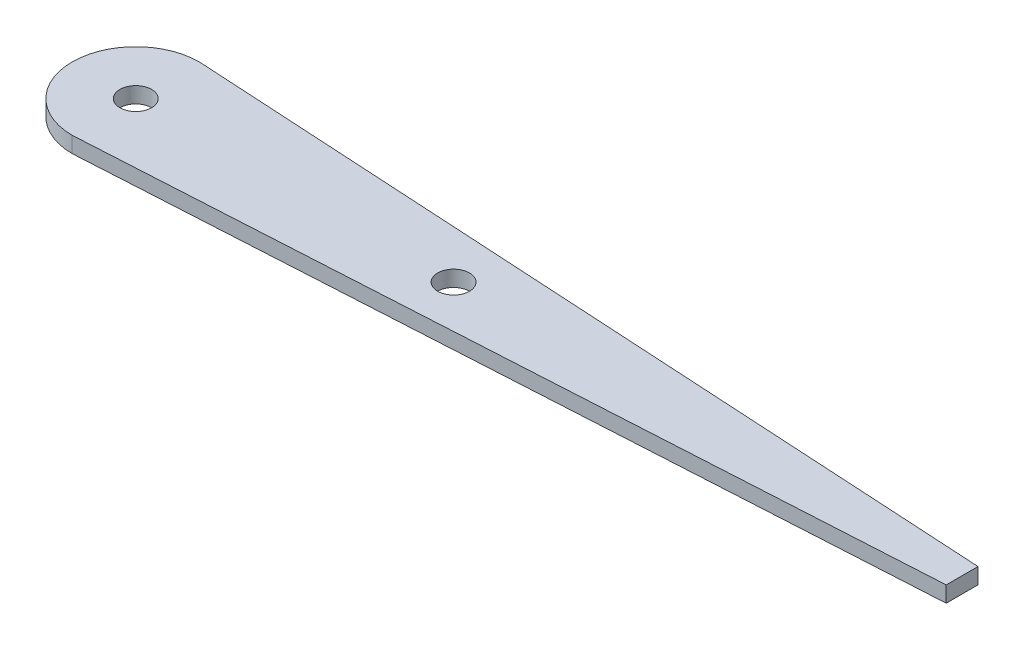
ISO-10303-21;
HEADER;
FILE_DESCRIPTION(('STEP AP214'),'2;1');
FILE_NAME('part.step','',(''),(''),'','','');
FILE_SCHEMA(('AUTOMOTIVE_DESIGN { 1 0 10303 214 1 1 1 1 }'));
ENDSEC;
DATA;
#1=APPLICATION_CONTEXT('core data for automotive mechanical design processes');
#2=APPLICATION_PROTOCOL_DEFINITION('international standard','automotive_design',2000,#1);
#3=PRODUCT_CONTEXT('',#1,'mechanical');
#4=PRODUCT('Part','Part','',(#3));
#5=PRODUCT_RELATED_PRODUCT_CATEGORY('part','',(#4));
#6=PRODUCT_DEFINITION_FORMATION('','',#4);
#7=PRODUCT_DEFINITION_CONTEXT('part definition',#1,'design');
#8=PRODUCT_DEFINITION('design','',#6,#7);
#9=PRODUCT_DEFINITION_SHAPE('','',#8);
#10=(LENGTH_UNIT() NAMED_UNIT(*) SI_UNIT(.MILLI.,.METRE.));
#11=(NAMED_UNIT(*) PLANE_ANGLE_UNIT() SI_UNIT($,.RADIAN.));
#12=(NAMED_UNIT(*) SI_UNIT($,.STERADIAN.) SOLID_ANGLE_UNIT());
#13=UNCERTAINTY_MEASURE_WITH_UNIT(LENGTH_MEASURE(1.E-05),#10,'distance_accuracy_value','');
#14=(GEOMETRIC_REPRESENTATION_CONTEXT(3) GLOBAL_UNCERTAINTY_ASSIGNED_CONTEXT((#13)) GLOBAL_UNIT_ASSIGNED_CONTEXT((#10,
#11,#12)) REPRESENTATION_CONTEXT('',''));
#15=CARTESIAN_POINT('',(0.,0.,0.));
#16=DIRECTION('',(0.,0.,1.));
#17=DIRECTION('',(1.,0.,0.));
#18=AXIS2_PLACEMENT_3D('',#15,#16,#17);
#19=CARTESIAN_POINT('',(-31.75,1.5875,0.));
#20=DIRECTION('',(0.,-1.,0.));
#21=DIRECTION('',(0.,0.,-1.));
#22=AXIS2_PLACEMENT_3D('',#19,#20,#21);
#23=PLANE('',#22);
#24=CARTESIAN_POINT('',(-31.75,1.5875,0.));
#25=DIRECTION('',(0.,1.,0.));
#26=DIRECTION('',(0.,0.,-1.));
#27=AXIS2_PLACEMENT_3D('',#24,#25,#26);
#28=CIRCLE('',#27,6.35);
#29=CARTESIAN_POINT('',(-31.75,1.5875,-6.35));
#30=VERTEX_POINT('',#29);
#31=CARTESIAN_POINT('',(-31.75,1.5875,6.35));
#32=VERTEX_POINT('',#31);
#33=EDGE_CURVE('E101',#30,#32,#28,.T.);
#34=ORIENTED_EDGE('',*,*,#33,.T.);
#35=DIRECTION('',(0.998339941675609,0.,-0.0575965350966698));
#36=VECTOR('',#35,1.);
#37=CARTESIAN_POINT('',(-31.75,1.5875,6.35));
#38=LINE('',#37,#36);
#39=CARTESIAN_POINT('',(50.8,1.5875,1.5875));
#40=VERTEX_POINT('',#39);
#41=EDGE_CURVE('E96',#32,#40,#38,.T.);
#42=ORIENTED_EDGE('',*,*,#41,.T.);
#43=DIRECTION('',(0.,0.,-1.));
#44=VECTOR('',#43,1.);
#45=CARTESIAN_POINT('',(50.8,1.5875,1.5875));
#46=LINE('',#45,#44);
#47=CARTESIAN_POINT('',(50.8,1.5875,-1.5875));
#48=VERTEX_POINT('',#47);
#49=EDGE_CURVE('E99',#40,#48,#46,.T.);
#50=ORIENTED_EDGE('',*,*,#49,.T.);
#51=DIRECTION('',(-0.998339941675609,0.,-0.0575965350966697));
#52=VECTOR('',#51,1.);
#53=CARTESIAN_POINT('',(-31.75,1.5875,-6.35));
#54=LINE('',#53,#52);
#55=EDGE_CURVE('E66',#48,#30,#54,.T.);
#56=ORIENTED_EDGE('',*,*,#55,.T.);
#57=EDGE_LOOP('',(#34,#42,#50,#56));
#58=FACE_BOUND('',#57,.T.);
#59=CARTESIAN_POINT('',(0.,1.5875,0.));
#60=DIRECTION('',(0.,1.,0.));
#61=DIRECTION('',(0.,0.,1.));
#62=AXIS2_PLACEMENT_3D('',#59,#60,#61);
#63=CIRCLE('',#62,1.5875);
#64=CARTESIAN_POINT('',(0.,1.5875,1.5875));
#65=VERTEX_POINT('',#64);
#66=EDGE_CURVE('E116',#65,#65,#63,.T.);
#67=ORIENTED_EDGE('',*,*,#66,.F.);
#68=EDGE_LOOP('',(#67));
#69=FACE_BOUND('',#68,.T.);
#70=CARTESIAN_POINT('',(-31.75,1.5875,0.));
#71=DIRECTION('',(0.,1.,0.));
#72=DIRECTION('',(0.,0.,1.));
#73=AXIS2_PLACEMENT_3D('',#70,#71,#72);
#74=CIRCLE('',#73,1.5875);
#75=CARTESIAN_POINT('',(-31.75,1.5875,1.5875));
#76=VERTEX_POINT('',#75);
#77=EDGE_CURVE('E131',#76,#76,#74,.T.);
#78=ORIENTED_EDGE('',*,*,#77,.F.);
#79=EDGE_LOOP('',(#78));
#80=FACE_BOUND('',#79,.T.);
#81=ADVANCED_FACE('F49',(#58,#69,#80),#23,.F.);
#82=CARTESIAN_POINT('',(-31.75,0.,0.));
#83=DIRECTION('',(0.,-1.,0.));
#84=DIRECTION('',(0.,0.,-1.));
#85=AXIS2_PLACEMENT_3D('',#82,#83,#84);
#86=PLANE('',#85);
#87=CARTESIAN_POINT('',(0.,0.,0.));
#88=DIRECTION('',(0.,1.,0.));
#89=DIRECTION('',(0.,0.,1.));
#90=AXIS2_PLACEMENT_3D('',#87,#88,#89);
#91=CIRCLE('',#90,1.5875);
#92=CARTESIAN_POINT('',(0.,0.,1.5875));
#93=VERTEX_POINT('',#92);
#94=EDGE_CURVE('E128',#93,#93,#91,.T.);
#95=ORIENTED_EDGE('',*,*,#94,.T.);
#96=EDGE_LOOP('',(#95));
#97=FACE_BOUND('',#96,.T.);
#98=CARTESIAN_POINT('',(-31.75,0.,0.));
#99=DIRECTION('',(0.,1.,0.));
#100=DIRECTION('',(0.,0.,-1.));
#101=AXIS2_PLACEMENT_3D('',#98,#99,#100);
#102=CIRCLE('',#101,6.35);
#103=CARTESIAN_POINT('',(-31.75,0.,-6.35));
#104=VERTEX_POINT('',#103);
#105=CARTESIAN_POINT('',(-31.75,0.,6.35));
#106=VERTEX_POINT('',#105);
#107=EDGE_CURVE('E113',#104,#106,#102,.T.);
#108=ORIENTED_EDGE('',*,*,#107,.F.);
#109=DIRECTION('',(-0.998339941675609,0.,-0.0575965350966697));
#110=VECTOR('',#109,1.);
#111=CARTESIAN_POINT('',(-31.75,0.,-6.35));
#112=LINE('',#111,#110);
#113=CARTESIAN_POINT('',(50.8,0.,-1.5875));
#114=VERTEX_POINT('',#113);
#115=EDGE_CURVE('E89',#114,#104,#112,.T.);
#116=ORIENTED_EDGE('',*,*,#115,.F.);
#117=DIRECTION('',(0.,0.,-1.));
#118=VECTOR('',#117,1.);
#119=CARTESIAN_POINT('',(50.8,0.,1.5875));
#120=LINE('',#119,#118);
#121=CARTESIAN_POINT('',(50.8,0.,1.5875));
#122=VERTEX_POINT('',#121);
#123=EDGE_CURVE('E83',#122,#114,#120,.T.);
#124=ORIENTED_EDGE('',*,*,#123,.F.);
#125=DIRECTION('',(0.998339941675609,0.,-0.0575965350966698));
#126=VECTOR('',#125,1.);
#127=CARTESIAN_POINT('',(-31.75,0.,6.35));
#128=LINE('',#127,#126);
#129=EDGE_CURVE('E105',#106,#122,#128,.T.);
#130=ORIENTED_EDGE('',*,*,#129,.F.);
#131=EDGE_LOOP('',(#108,#116,#124,#130));
#132=FACE_BOUND('',#131,.T.);
#133=CARTESIAN_POINT('',(-31.75,0.,0.));
#134=DIRECTION('',(0.,1.,0.));
#135=DIRECTION('',(0.,0.,1.));
#136=AXIS2_PLACEMENT_3D('',#133,#134,#135);
#137=CIRCLE('',#136,1.5875);
#138=CARTESIAN_POINT('',(-31.75,0.,1.5875));
#139=VERTEX_POINT('',#138);
#140=EDGE_CURVE('E134',#139,#139,#137,.T.);
#141=ORIENTED_EDGE('',*,*,#140,.T.);
#142=EDGE_LOOP('',(#141));
#143=FACE_BOUND('',#142,.T.);
#144=ADVANCED_FACE('F124',(#97,#132,#143),#86,.T.);
#145=CARTESIAN_POINT('',(-31.75,1.5875,0.));
#146=DIRECTION('',(0.,-1.,0.));
#147=DIRECTION('',(0.,0.,-1.));
#148=AXIS2_PLACEMENT_3D('',#145,#146,#147);
#149=CYLINDRICAL_SURFACE('',#148,6.35);
#150=ORIENTED_EDGE('',*,*,#107,.T.);
#151=DIRECTION('',(0.,-1.,0.));
#152=VECTOR('',#151,1.);
#153=CARTESIAN_POINT('',(-31.75,1.5875,6.35));
#154=LINE('',#153,#152);
#155=EDGE_CURVE('E13',#32,#106,#154,.T.);
#156=ORIENTED_EDGE('',*,*,#155,.F.);
#157=ORIENTED_EDGE('',*,*,#33,.F.);
#158=DIRECTION('',(0.,-1.,0.));
#159=VECTOR('',#158,1.);
#160=CARTESIAN_POINT('',(-31.75,1.5875,-6.35));
#161=LINE('',#160,#159);
#162=EDGE_CURVE('E109',#30,#104,#161,.T.);
#163=ORIENTED_EDGE('',*,*,#162,.T.);
#164=EDGE_LOOP('',(#150,#156,#157,#163));
#165=FACE_BOUND('',#164,.T.);
#166=ADVANCED_FACE('F51',(#165),#149,.T.);
#167=CARTESIAN_POINT('',(-31.75,1.5875,6.35));
#168=DIRECTION('',(-0.0575965350966698,0.,-0.998339941675609));
#169=DIRECTION('',(-0.998339941675609,0.,0.0575965350966698));
#170=AXIS2_PLACEMENT_3D('',#167,#168,#169);
#171=PLANE('',#170);
#172=ORIENTED_EDGE('',*,*,#129,.T.);
#173=DIRECTION('',(0.,-1.,0.));
#174=VECTOR('',#173,1.);
#175=CARTESIAN_POINT('',(50.8,1.5875,1.5875));
#176=LINE('',#175,#174);
#177=EDGE_CURVE('E58',#40,#122,#176,.T.);
#178=ORIENTED_EDGE('',*,*,#177,.F.);
#179=ORIENTED_EDGE('',*,*,#41,.F.);
#180=ORIENTED_EDGE('',*,*,#155,.T.);
#181=EDGE_LOOP('',(#172,#178,#179,#180));
#182=FACE_BOUND('',#181,.T.);
#183=ADVANCED_FACE('F104',(#182),#171,.F.);
#184=CARTESIAN_POINT('',(50.8,1.5875,1.5875));
#185=DIRECTION('',(-1.,0.,0.));
#186=DIRECTION('',(0.,0.,1.));
#187=AXIS2_PLACEMENT_3D('',#184,#185,#186);
#188=PLANE('',#187);
#189=ORIENTED_EDGE('',*,*,#123,.T.);
#190=DIRECTION('',(0.,-1.,0.));
#191=VECTOR('',#190,1.);
#192=CARTESIAN_POINT('',(50.8,1.5875,-1.5875));
#193=LINE('',#192,#191);
#194=EDGE_CURVE('E106',#48,#114,#193,.T.);
#195=ORIENTED_EDGE('',*,*,#194,.F.);
#196=ORIENTED_EDGE('',*,*,#49,.F.);
#197=ORIENTED_EDGE('',*,*,#177,.T.);
#198=EDGE_LOOP('',(#189,#195,#196,#197));
#199=FACE_BOUND('',#198,.T.);
#200=ADVANCED_FACE('F107',(#199),#188,.F.);
#201=CARTESIAN_POINT('',(-31.75,1.5875,-6.35));
#202=DIRECTION('',(-0.0575965350966697,0.,0.998339941675609));
#203=DIRECTION('',(0.998339941675609,0.,0.0575965350966697));
#204=AXIS2_PLACEMENT_3D('',#201,#202,#203);
#205=PLANE('',#204);
#206=ORIENTED_EDGE('',*,*,#115,.T.);
#207=ORIENTED_EDGE('',*,*,#162,.F.);
#208=ORIENTED_EDGE('',*,*,#55,.F.);
#209=ORIENTED_EDGE('',*,*,#194,.T.);
#210=EDGE_LOOP('',(#206,#207,#208,#209));
#211=FACE_BOUND('',#210,.T.);
#212=ADVANCED_FACE('F121',(#211),#205,.F.);
#213=CARTESIAN_POINT('',(0.,1.5875,0.));
#214=DIRECTION('',(0.,-1.,0.));
#215=DIRECTION('',(0.,0.,-1.));
#216=AXIS2_PLACEMENT_3D('',#213,#214,#215);
#217=CYLINDRICAL_SURFACE('',#216,1.5875);
#218=ORIENTED_EDGE('',*,*,#66,.T.);
#219=EDGE_LOOP('',(#218));
#220=FACE_BOUND('',#219,.T.);
#221=ORIENTED_EDGE('',*,*,#94,.F.);
#222=EDGE_LOOP('',(#221));
#223=FACE_BOUND('',#222,.T.);
#224=ADVANCED_FACE('F151',(#220,#223),#217,.F.);
#225=CARTESIAN_POINT('',(-31.75,1.5875,0.));
#226=DIRECTION('',(0.,-1.,0.));
#227=DIRECTION('',(0.,0.,-1.));
#228=AXIS2_PLACEMENT_3D('',#225,#226,#227);
#229=CYLINDRICAL_SURFACE('',#228,1.5875);
#230=ORIENTED_EDGE('',*,*,#77,.T.);
#231=EDGE_LOOP('',(#230));
#232=FACE_BOUND('',#231,.T.);
#233=ORIENTED_EDGE('',*,*,#140,.F.);
#234=EDGE_LOOP('',(#233));
#235=FACE_BOUND('',#234,.T.);
#236=ADVANCED_FACE('F140',(#232,#235),#229,.F.);
#237=CLOSED_SHELL('',(#81,#144,#166,#183,#200,#212,#224,#236));
#238=MANIFOLD_SOLID_BREP('B2',#237);
#239=ADVANCED_BREP_SHAPE_REPRESENTATION('',(#18,#238),#14);
#240=SHAPE_DEFINITION_REPRESENTATION(#9,#239);
ENDSEC;
END-ISO-10303-21;
